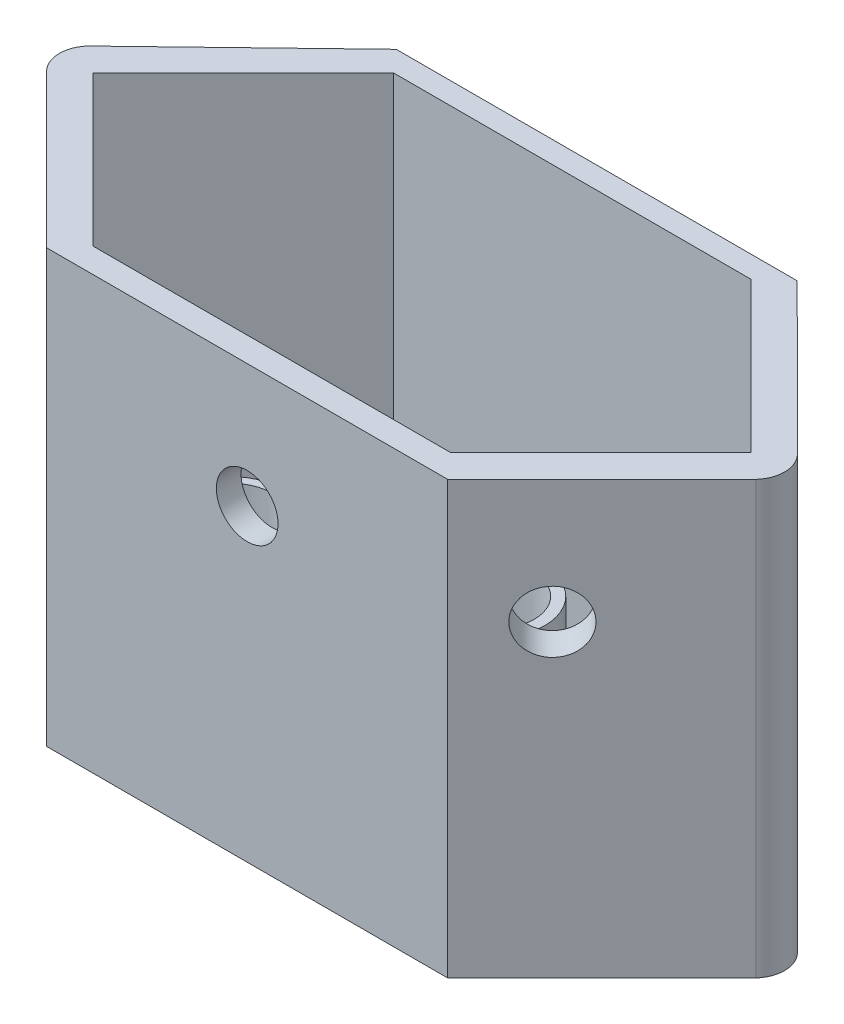
ISO-10303-21;
HEADER;
FILE_DESCRIPTION(('STEP AP214'),'2;1');
FILE_NAME('part.step','',(''),(''),'','','');
FILE_SCHEMA(('AUTOMOTIVE_DESIGN { 1 0 10303 214 1 1 1 1 }'));
ENDSEC;
DATA;
#1=APPLICATION_CONTEXT('core data for automotive mechanical design processes');
#2=APPLICATION_PROTOCOL_DEFINITION('international standard','automotive_design',2000,#1);
#3=PRODUCT_CONTEXT('',#1,'mechanical');
#4=PRODUCT('Part','Part','',(#3));
#5=PRODUCT_RELATED_PRODUCT_CATEGORY('part','',(#4));
#6=PRODUCT_DEFINITION_FORMATION('','',#4);
#7=PRODUCT_DEFINITION_CONTEXT('part definition',#1,'design');
#8=PRODUCT_DEFINITION('design','',#6,#7);
#9=PRODUCT_DEFINITION_SHAPE('','',#8);
#10=(LENGTH_UNIT() NAMED_UNIT(*) SI_UNIT(.MILLI.,.METRE.));
#11=(NAMED_UNIT(*) PLANE_ANGLE_UNIT() SI_UNIT($,.RADIAN.));
#12=(NAMED_UNIT(*) SI_UNIT($,.STERADIAN.) SOLID_ANGLE_UNIT());
#13=UNCERTAINTY_MEASURE_WITH_UNIT(LENGTH_MEASURE(1.E-05),#10,'distance_accuracy_value','');
#14=(GEOMETRIC_REPRESENTATION_CONTEXT(3) GLOBAL_UNCERTAINTY_ASSIGNED_CONTEXT((#13)) GLOBAL_UNIT_ASSIGNED_CONTEXT((#10,
#11,#12)) REPRESENTATION_CONTEXT('',''));
#15=CARTESIAN_POINT('',(0.,0.,0.));
#16=DIRECTION('',(0.,0.,1.));
#17=DIRECTION('',(1.,0.,0.));
#18=AXIS2_PLACEMENT_3D('',#15,#16,#17);
#19=CARTESIAN_POINT('',(0.,1.2,0.));
#20=DIRECTION('',(0.,1.,0.));
#21=DIRECTION('',(0.,0.,1.));
#22=AXIS2_PLACEMENT_3D('',#19,#20,#21);
#23=PLANE('',#22);
#24=CARTESIAN_POINT('',(0.,1.2,-3.5));
#25=DIRECTION('',(0.,1.,0.));
#26=DIRECTION('',(0.,0.,1.));
#27=AXIS2_PLACEMENT_3D('',#24,#25,#26);
#28=CIRCLE('',#27,2.46889669809637);
#29=CARTESIAN_POINT('',(0.,1.2,-1.03110330190363));
#30=VERTEX_POINT('',#29);
#31=EDGE_CURVE('E243',#30,#30,#28,.T.);
#32=ORIENTED_EDGE('',*,*,#31,.F.);
#33=EDGE_LOOP('',(#32));
#34=FACE_BOUND('',#33,.T.);
#35=DIRECTION('',(1.,0.,0.));
#36=VECTOR('',#35,1.);
#37=CARTESIAN_POINT('',(0.,1.2,-7.3));
#38=LINE('',#37,#36);
#39=CARTESIAN_POINT('',(-8.69142135623738,1.2,-7.3));
#40=VERTEX_POINT('',#39);
#41=CARTESIAN_POINT('',(8.6914213562373,1.2,-7.3));
#42=VERTEX_POINT('',#41);
#43=EDGE_CURVE('E191',#40,#42,#38,.T.);
#44=ORIENTED_EDGE('',*,*,#43,.F.);
#45=DIRECTION('',(-0.707106781186547,0.,0.707106781186548));
#46=VECTOR('',#45,1.);
#47=CARTESIAN_POINT('',(-7.9957106781187,1.2,-7.99571067811869));
#48=LINE('',#47,#46);
#49=CARTESIAN_POINT('',(-15.9914213562374,1.2,0.));
#50=VERTEX_POINT('',#49);
#51=EDGE_CURVE('E216',#40,#50,#48,.T.);
#52=ORIENTED_EDGE('',*,*,#51,.T.);
#53=DIRECTION('',(0.707106781186548,0.,0.707106781186547));
#54=VECTOR('',#53,1.);
#55=CARTESIAN_POINT('',(-7.99571067811869,1.2,7.99571067811869));
#56=LINE('',#55,#54);
#57=CARTESIAN_POINT('',(-8.69142135623745,1.2,7.29999999999993));
#58=VERTEX_POINT('',#57);
#59=EDGE_CURVE('E209',#50,#58,#56,.T.);
#60=ORIENTED_EDGE('',*,*,#59,.T.);
#61=DIRECTION('',(1.,0.,0.));
#62=VECTOR('',#61,1.);
#63=CARTESIAN_POINT('',(0.,1.2,7.3));
#64=LINE('',#63,#62);
#65=CARTESIAN_POINT('',(8.69142135623732,1.2,7.3));
#66=VERTEX_POINT('',#65);
#67=EDGE_CURVE('E193',#58,#66,#64,.T.);
#68=ORIENTED_EDGE('',*,*,#67,.T.);
#69=DIRECTION('',(-0.707106781186547,0.,0.707106781186548));
#70=VECTOR('',#69,1.);
#71=CARTESIAN_POINT('',(7.99571067811866,1.2,7.99571067811866));
#72=LINE('',#71,#70);
#73=CARTESIAN_POINT('',(15.9914213562373,1.2,0.));
#74=VERTEX_POINT('',#73);
#75=EDGE_CURVE('E230',#74,#66,#72,.T.);
#76=ORIENTED_EDGE('',*,*,#75,.F.);
#77=DIRECTION('',(0.707106781186548,0.,0.707106781186547));
#78=VECTOR('',#77,1.);
#79=CARTESIAN_POINT('',(7.99571067811865,1.2,-7.99571067811865));
#80=LINE('',#79,#78);
#81=EDGE_CURVE('E224',#42,#74,#80,.T.);
#82=ORIENTED_EDGE('',*,*,#81,.F.);
#83=EDGE_LOOP('',(#44,#52,#60,#68,#76,#82));
#84=FACE_BOUND('',#83,.T.);
#85=CARTESIAN_POINT('',(-9.75,1.2,-0.499999999999995));
#86=DIRECTION('',(0.,1.,0.));
#87=DIRECTION('',(0.,0.,1.));
#88=AXIS2_PLACEMENT_3D('',#85,#86,#87);
#89=CIRCLE('',#88,2.35);
#90=CARTESIAN_POINT('',(-9.75,1.2,1.85));
#91=VERTEX_POINT('',#90);
#92=EDGE_CURVE('E234',#91,#91,#89,.T.);
#93=ORIENTED_EDGE('',*,*,#92,.F.);
#94=EDGE_LOOP('',(#93));
#95=FACE_BOUND('',#94,.T.);
#96=CARTESIAN_POINT('',(9.75,1.2,-0.499999999999997));
#97=DIRECTION('',(0.,1.,0.));
#98=DIRECTION('',(0.,0.,1.));
#99=AXIS2_PLACEMENT_3D('',#96,#97,#98);
#100=CIRCLE('',#99,2.35);
#101=CARTESIAN_POINT('',(9.75,1.2,1.85));
#102=VERTEX_POINT('',#101);
#103=EDGE_CURVE('E252',#102,#102,#100,.T.);
#104=ORIENTED_EDGE('',*,*,#103,.F.);
#105=EDGE_LOOP('',(#104));
#106=FACE_BOUND('',#105,.T.);
#107=ADVANCED_FACE('F34',(#34,#84,#95,#106),#23,.T.);
#108=CARTESIAN_POINT('',(-16.1317993042843,25.,1.73426092409168E-05));
#109=DIRECTION('',(0.,-1.,0.));
#110=DIRECTION('',(0.,0.,-1.));
#111=AXIS2_PLACEMENT_3D('',#108,#109,#110);
#112=CYLINDRICAL_SURFACE('',#111,1.5001676066185);
#113=CARTESIAN_POINT('',(-16.1317993042843,21.,1.73426092409168E-05));
#114=DIRECTION('',(0.,-1.,0.));
#115=DIRECTION('',(0.,0.,-1.));
#116=AXIS2_PLACEMENT_3D('',#113,#114,#115);
#117=CIRCLE('',#116,1.5001676066185);
#118=CARTESIAN_POINT('',(-17.2503076661575,21.,-0.999703564627948));
#119=VERTEX_POINT('',#118);
#120=CARTESIAN_POINT('',(-17.250692691761,21.,0.99930730823902));
#121=VERTEX_POINT('',#120);
#122=EDGE_CURVE('E138',#119,#121,#117,.F.);
#123=ORIENTED_EDGE('',*,*,#122,.F.);
#124=DIRECTION('',(0.,-1.,0.));
#125=VECTOR('',#124,1.);
#126=CARTESIAN_POINT('',(-17.2503076661575,25.,-0.999703564627948));
#127=LINE('',#126,#125);
#128=CARTESIAN_POINT('',(-17.2503076661575,0.,-0.999703564627948));
#129=VERTEX_POINT('',#128);
#130=EDGE_CURVE('E168',#119,#129,#127,.T.);
#131=ORIENTED_EDGE('',*,*,#130,.T.);
#132=CARTESIAN_POINT('',(-16.1317993042843,0.,1.73426092409168E-05));
#133=DIRECTION('',(0.,1.,0.));
#134=DIRECTION('',(0.,0.,1.));
#135=AXIS2_PLACEMENT_3D('',#132,#133,#134);
#136=CIRCLE('',#135,1.5001676066185);
#137=CARTESIAN_POINT('',(-17.250692691761,0.,0.999307308239028));
#138=VERTEX_POINT('',#137);
#139=EDGE_CURVE('E188',#138,#129,#136,.F.);
#140=ORIENTED_EDGE('',*,*,#139,.F.);
#141=DIRECTION('',(0.,-1.,0.));
#142=VECTOR('',#141,1.);
#143=CARTESIAN_POINT('',(-17.250692691761,25.,0.999307308239028));
#144=LINE('',#143,#142);
#145=EDGE_CURVE('E42',#121,#138,#144,.T.);
#146=ORIENTED_EDGE('',*,*,#145,.F.);
#147=EDGE_LOOP('',(#123,#131,#140,#146));
#148=FACE_BOUND('',#147,.T.);
#149=ADVANCED_FACE('F36',(#148),#112,.T.);
#150=CARTESIAN_POINT('',(-9.12499999999994,25.,9.12500000000004));
#151=DIRECTION('',(-0.707106781186543,0.,0.707106781186552));
#152=DIRECTION('',(0.707106781186552,0.,0.707106781186543));
#153=AXIS2_PLACEMENT_3D('',#150,#151,#152);
#154=PLANE('',#153);
#155=CARTESIAN_POINT('',(-12.437005768509,15.,5.81299423149103));
#156=DIRECTION('',(-0.707106781186543,0.,0.707106781186552));
#157=DIRECTION('',(0.707106781186552,0.,0.707106781186543));
#158=AXIS2_PLACEMENT_3D('',#155,#156,#157);
#159=CIRCLE('',#158,1.5);
#160=CARTESIAN_POINT('',(-11.3763455967292,15.,6.87365440327084));
#161=VERTEX_POINT('',#160);
#162=EDGE_CURVE('E292',#161,#161,#159,.T.);
#163=ORIENTED_EDGE('',*,*,#162,.F.);
#164=EDGE_LOOP('',(#163));
#165=FACE_BOUND('',#164,.T.);
#166=DIRECTION('',(0.707106781186552,0.,0.707106781186543));
#167=VECTOR('',#166,1.);
#168=CARTESIAN_POINT('',(-9.12499999999994,21.,9.12500000000004));
#169=LINE('',#168,#167);
#170=CARTESIAN_POINT('',(-9.74999999999999,21.,8.5));
#171=VERTEX_POINT('',#170);
#172=EDGE_CURVE('E132',#121,#171,#169,.T.);
#173=ORIENTED_EDGE('',*,*,#172,.F.);
#174=ORIENTED_EDGE('',*,*,#145,.T.);
#175=DIRECTION('',(-0.707106781186552,0.,-0.707106781186543));
#176=VECTOR('',#175,1.);
#177=CARTESIAN_POINT('',(-9.12499999999994,0.,9.12500000000004));
#178=LINE('',#177,#176);
#179=CARTESIAN_POINT('',(-9.74999999999999,0.,8.50000000000001));
#180=VERTEX_POINT('',#179);
#181=EDGE_CURVE('E156',#180,#138,#178,.T.);
#182=ORIENTED_EDGE('',*,*,#181,.F.);
#183=DIRECTION('',(0.,-1.,0.));
#184=VECTOR('',#183,1.);
#185=CARTESIAN_POINT('',(-9.74999999999999,25.,8.50000000000001));
#186=LINE('',#185,#184);
#187=EDGE_CURVE('E148',#171,#180,#186,.T.);
#188=ORIENTED_EDGE('',*,*,#187,.F.);
#189=EDGE_LOOP('',(#173,#174,#182,#188));
#190=FACE_BOUND('',#189,.T.);
#191=ADVANCED_FACE('F154',(#165,#190),#154,.T.);
#192=CARTESIAN_POINT('',(0.,25.,8.5));
#193=DIRECTION('',(0.,0.,-1.));
#194=DIRECTION('',(-1.,0.,0.));
#195=AXIS2_PLACEMENT_3D('',#192,#193,#194);
#196=PLANE('',#195);
#197=CARTESIAN_POINT('',(0.,15.,8.5));
#198=DIRECTION('',(0.,0.,-1.));
#199=DIRECTION('',(-1.,0.,0.));
#200=AXIS2_PLACEMENT_3D('',#197,#198,#199);
#201=CIRCLE('',#200,1.5);
#202=CARTESIAN_POINT('',(-1.50000000000007,15.,8.5));
#203=VERTEX_POINT('',#202);
#204=EDGE_CURVE('E286',#203,#203,#201,.T.);
#205=ORIENTED_EDGE('',*,*,#204,.T.);
#206=EDGE_LOOP('',(#205));
#207=FACE_BOUND('',#206,.T.);
#208=DIRECTION('',(0.,-1.,0.));
#209=VECTOR('',#208,1.);
#210=CARTESIAN_POINT('',(9.75,25.,8.5));
#211=LINE('',#210,#209);
#212=CARTESIAN_POINT('',(9.75000000000001,21.,8.5));
#213=VERTEX_POINT('',#212);
#214=CARTESIAN_POINT('',(9.75,0.,8.5));
#215=VERTEX_POINT('',#214);
#216=EDGE_CURVE('E150',#213,#215,#211,.T.);
#217=ORIENTED_EDGE('',*,*,#216,.F.);
#218=DIRECTION('',(1.,0.,0.));
#219=VECTOR('',#218,1.);
#220=CARTESIAN_POINT('',(-41.5470865906406,21.,8.5));
#221=LINE('',#220,#219);
#222=EDGE_CURVE('E135',#171,#213,#221,.T.);
#223=ORIENTED_EDGE('',*,*,#222,.F.);
#224=ORIENTED_EDGE('',*,*,#187,.T.);
#225=DIRECTION('',(1.,0.,0.));
#226=VECTOR('',#225,1.);
#227=CARTESIAN_POINT('',(0.,0.,8.5));
#228=LINE('',#227,#226);
#229=EDGE_CURVE('E185',#180,#215,#228,.T.);
#230=ORIENTED_EDGE('',*,*,#229,.T.);
#231=EDGE_LOOP('',(#217,#223,#224,#230));
#232=FACE_BOUND('',#231,.T.);
#233=ADVANCED_FACE('F146',(#207,#232),#196,.F.);
#234=CARTESIAN_POINT('',(9.12500000000002,25.,9.12499999999999));
#235=DIRECTION('',(-0.707106781186549,0.,-0.707106781186546));
#236=DIRECTION('',(-0.707106781186546,0.,0.707106781186549));
#237=AXIS2_PLACEMENT_3D('',#234,#235,#236);
#238=PLANE('',#237);
#239=CARTESIAN_POINT('',(12.2955844122716,15.,5.95441558772842));
#240=DIRECTION('',(-0.707106781186549,0.,-0.707106781186546));
#241=DIRECTION('',(-0.707106781186546,0.,0.707106781186549));
#242=AXIS2_PLACEMENT_3D('',#239,#240,#241);
#243=CIRCLE('',#242,1.5);
#244=CARTESIAN_POINT('',(11.2349242404918,15.,7.01507575950825));
#245=VERTEX_POINT('',#244);
#246=EDGE_CURVE('E151',#245,#245,#243,.T.);
#247=ORIENTED_EDGE('',*,*,#246,.T.);
#248=EDGE_LOOP('',(#247));
#249=FACE_BOUND('',#248,.T.);
#250=DIRECTION('',(0.,-1.,0.));
#251=VECTOR('',#250,1.);
#252=CARTESIAN_POINT('',(17.2499999999999,25.,1.00000000000006));
#253=LINE('',#252,#251);
#254=CARTESIAN_POINT('',(17.2499999999999,21.,1.00000000000005));
#255=VERTEX_POINT('',#254);
#256=CARTESIAN_POINT('',(17.2499999999999,0.,1.00000000000006));
#257=VERTEX_POINT('',#256);
#258=EDGE_CURVE('E158',#255,#257,#253,.T.);
#259=ORIENTED_EDGE('',*,*,#258,.F.);
#260=DIRECTION('',(-0.707106781186546,0.,0.707106781186549));
#261=VECTOR('',#260,1.);
#262=CARTESIAN_POINT('',(9.12500000000002,21.,9.12499999999999));
#263=LINE('',#262,#261);
#264=EDGE_CURVE('E260',#255,#213,#263,.T.);
#265=ORIENTED_EDGE('',*,*,#264,.T.);
#266=ORIENTED_EDGE('',*,*,#216,.T.);
#267=DIRECTION('',(0.707106781186546,0.,-0.707106781186549));
#268=VECTOR('',#267,1.);
#269=CARTESIAN_POINT('',(9.12500000000002,0.,9.12499999999999));
#270=LINE('',#269,#268);
#271=EDGE_CURVE('E182',#215,#257,#270,.T.);
#272=ORIENTED_EDGE('',*,*,#271,.T.);
#273=EDGE_LOOP('',(#259,#265,#266,#272));
#274=FACE_BOUND('',#273,.T.);
#275=ADVANCED_FACE('F409',(#249,#274),#238,.F.);
#276=CARTESIAN_POINT('',(16.1319660112501,25.,0.));
#277=DIRECTION('',(0.,-1.,0.));
#278=DIRECTION('',(0.,0.,-1.));
#279=AXIS2_PLACEMENT_3D('',#276,#277,#278);
#280=CYLINDRICAL_SURFACE('',#279,1.5);
#281=CARTESIAN_POINT('',(16.1319660112501,21.,0.));
#282=DIRECTION('',(0.,-1.,0.));
#283=DIRECTION('',(0.,0.,-1.));
#284=AXIS2_PLACEMENT_3D('',#281,#282,#283);
#285=CIRCLE('',#284,1.5);
#286=CARTESIAN_POINT('',(17.25,21.,-1.00000000000001));
#287=VERTEX_POINT('',#286);
#288=EDGE_CURVE('E262',#255,#287,#285,.F.);
#289=ORIENTED_EDGE('',*,*,#288,.F.);
#290=ORIENTED_EDGE('',*,*,#258,.T.);
#291=CARTESIAN_POINT('',(16.1319660112501,0.,0.));
#292=DIRECTION('',(0.,1.,0.));
#293=DIRECTION('',(0.,0.,1.));
#294=AXIS2_PLACEMENT_3D('',#291,#292,#293);
#295=CIRCLE('',#294,1.5);
#296=CARTESIAN_POINT('',(17.25,0.,-1.00000000000002));
#297=VERTEX_POINT('',#296);
#298=EDGE_CURVE('E179',#297,#257,#295,.F.);
#299=ORIENTED_EDGE('',*,*,#298,.F.);
#300=DIRECTION('',(0.,-1.,0.));
#301=VECTOR('',#300,1.);
#302=CARTESIAN_POINT('',(17.25,25.,-1.00000000000002));
#303=LINE('',#302,#301);
#304=EDGE_CURVE('E162',#287,#297,#303,.T.);
#305=ORIENTED_EDGE('',*,*,#304,.F.);
#306=EDGE_LOOP('',(#289,#290,#299,#305));
#307=FACE_BOUND('',#306,.T.);
#308=ADVANCED_FACE('F415',(#307),#280,.T.);
#309=CARTESIAN_POINT('',(9.12196362464636,25.,-9.12517548550626));
#310=DIRECTION('',(0.70698230532064,0.,-0.707231235144145));
#311=DIRECTION('',(-0.707231235144145,0.,-0.70698230532064));
#312=AXIS2_PLACEMENT_3D('',#309,#310,#311);
#313=PLANE('',#312);
#314=DIRECTION('',(-0.707231235144145,0.,-0.70698230532064));
#315=VECTOR('',#314,1.);
#316=CARTESIAN_POINT('',(9.12196362464636,21.,-9.12517548550626));
#317=LINE('',#316,#315);
#318=CARTESIAN_POINT('',(9.88811198114129,21.,-8.35929679636435));
#319=VERTEX_POINT('',#318);
#320=EDGE_CURVE('E264',#287,#319,#317,.T.);
#321=ORIENTED_EDGE('',*,*,#320,.F.);
#322=ORIENTED_EDGE('',*,*,#304,.T.);
#323=DIRECTION('',(0.707231235144145,0.,0.70698230532064));
#324=VECTOR('',#323,1.);
#325=CARTESIAN_POINT('',(9.12196362464636,0.,-9.12517548550626));
#326=LINE('',#325,#324);
#327=CARTESIAN_POINT('',(9.88811198114129,0.,-8.35929679636435));
#328=VERTEX_POINT('',#327);
#329=EDGE_CURVE('E176',#328,#297,#326,.T.);
#330=ORIENTED_EDGE('',*,*,#329,.F.);
#331=DIRECTION('',(0.,-1.,0.));
#332=VECTOR('',#331,1.);
#333=CARTESIAN_POINT('',(9.88811198114129,25.,-8.35929679636435));
#334=LINE('',#333,#332);
#335=EDGE_CURVE('E164',#319,#328,#334,.T.);
#336=ORIENTED_EDGE('',*,*,#335,.F.);
#337=EDGE_LOOP('',(#321,#322,#330,#336));
#338=FACE_BOUND('',#337,.T.);
#339=ADVANCED_FACE('F419',(#338),#313,.T.);
#340=CARTESIAN_POINT('',(0.,25.,-8.35929679636435));
#341=DIRECTION('',(0.,0.,-1.));
#342=DIRECTION('',(-1.,0.,0.));
#343=AXIS2_PLACEMENT_3D('',#340,#341,#342);
#344=PLANE('',#343);
#345=DIRECTION('',(-1.,0.,0.));
#346=VECTOR('',#345,1.);
#347=CARTESIAN_POINT('',(0.,21.,-8.35929679636435));
#348=LINE('',#347,#346);
#349=CARTESIAN_POINT('',(-9.61188801885871,21.,-8.35929679636435));
#350=VERTEX_POINT('',#349);
#351=EDGE_CURVE('E49',#319,#350,#348,.T.);
#352=ORIENTED_EDGE('',*,*,#351,.F.);
#353=ORIENTED_EDGE('',*,*,#335,.T.);
#354=DIRECTION('',(1.,0.,0.));
#355=VECTOR('',#354,1.);
#356=CARTESIAN_POINT('',(0.,0.,-8.35929679636435));
#357=LINE('',#356,#355);
#358=CARTESIAN_POINT('',(-9.61188801885871,0.,-8.35929679636435));
#359=VERTEX_POINT('',#358);
#360=EDGE_CURVE('E173',#359,#328,#357,.T.);
#361=ORIENTED_EDGE('',*,*,#360,.F.);
#362=DIRECTION('',(0.,-1.,0.));
#363=VECTOR('',#362,1.);
#364=CARTESIAN_POINT('',(-9.61188801885871,25.,-8.35929679636435));
#365=LINE('',#364,#363);
#366=EDGE_CURVE('E166',#350,#359,#365,.T.);
#367=ORIENTED_EDGE('',*,*,#366,.F.);
#368=EDGE_LOOP('',(#352,#353,#361,#367));
#369=FACE_BOUND('',#368,.T.);
#370=ADVANCED_FACE('F423',(#369),#344,.T.);
#371=CARTESIAN_POINT('',(-8.80407243656507,25.,-9.13762456132839));
#372=DIRECTION('',(-0.693841143676791,0.,-0.720128090926387));
#373=DIRECTION('',(-0.720128090926387,0.,0.693841143676791));
#374=AXIS2_PLACEMENT_3D('',#371,#372,#373);
#375=PLANE('',#374);
#376=DIRECTION('',(-0.720128090926387,0.,0.693841143676791));
#377=VECTOR('',#376,1.);
#378=CARTESIAN_POINT('',(-8.80407243656507,21.,-9.13762456132839));
#379=LINE('',#378,#377);
#380=EDGE_CURVE('E267',#350,#119,#379,.T.);
#381=ORIENTED_EDGE('',*,*,#380,.F.);
#382=ORIENTED_EDGE('',*,*,#366,.T.);
#383=DIRECTION('',(0.720128090926387,0.,-0.693841143676791));
#384=VECTOR('',#383,1.);
#385=CARTESIAN_POINT('',(-8.80407243656507,0.,-9.13762456132839));
#386=LINE('',#385,#384);
#387=EDGE_CURVE('E170',#129,#359,#386,.T.);
#388=ORIENTED_EDGE('',*,*,#387,.F.);
#389=ORIENTED_EDGE('',*,*,#130,.F.);
#390=EDGE_LOOP('',(#381,#382,#388,#389));
#391=FACE_BOUND('',#390,.T.);
#392=ADVANCED_FACE('F427',(#391),#375,.T.);
#393=CARTESIAN_POINT('',(0.,0.,0.));
#394=DIRECTION('',(0.,1.,0.));
#395=DIRECTION('',(0.,0.,1.));
#396=AXIS2_PLACEMENT_3D('',#393,#394,#395);
#397=PLANE('',#396);
#398=CARTESIAN_POINT('',(-9.75,0.,-0.499999999999995));
#399=DIRECTION('',(0.,1.,0.));
#400=DIRECTION('',(0.,0.,1.));
#401=AXIS2_PLACEMENT_3D('',#398,#399,#400);
#402=CIRCLE('',#401,1.95);
#403=CARTESIAN_POINT('',(-9.75,0.,1.45000000000001));
#404=VERTEX_POINT('',#403);
#405=EDGE_CURVE('E198',#404,#404,#402,.T.);
#406=ORIENTED_EDGE('',*,*,#405,.T.);
#407=EDGE_LOOP('',(#406));
#408=FACE_BOUND('',#407,.T.);
#409=CARTESIAN_POINT('',(9.75,0.,-0.499999999999997));
#410=DIRECTION('',(0.,1.,0.));
#411=DIRECTION('',(0.,0.,1.));
#412=AXIS2_PLACEMENT_3D('',#409,#410,#411);
#413=CIRCLE('',#412,1.95);
#414=CARTESIAN_POINT('',(9.75,0.,1.45));
#415=VERTEX_POINT('',#414);
#416=EDGE_CURVE('E201',#415,#415,#413,.T.);
#417=ORIENTED_EDGE('',*,*,#416,.T.);
#418=EDGE_LOOP('',(#417));
#419=FACE_BOUND('',#418,.T.);
#420=CARTESIAN_POINT('',(0.,0.,-3.5));
#421=DIRECTION('',(0.,1.,0.));
#422=DIRECTION('',(0.,0.,1.));
#423=AXIS2_PLACEMENT_3D('',#420,#421,#422);
#424=CIRCLE('',#423,1.95);
#425=CARTESIAN_POINT('',(0.,0.,-1.55));
#426=VERTEX_POINT('',#425);
#427=EDGE_CURVE('E195',#426,#426,#424,.T.);
#428=ORIENTED_EDGE('',*,*,#427,.T.);
#429=EDGE_LOOP('',(#428));
#430=FACE_BOUND('',#429,.T.);
#431=ORIENTED_EDGE('',*,*,#139,.T.);
#432=ORIENTED_EDGE('',*,*,#387,.T.);
#433=ORIENTED_EDGE('',*,*,#360,.T.);
#434=ORIENTED_EDGE('',*,*,#329,.T.);
#435=ORIENTED_EDGE('',*,*,#298,.T.);
#436=ORIENTED_EDGE('',*,*,#271,.F.);
#437=ORIENTED_EDGE('',*,*,#229,.F.);
#438=ORIENTED_EDGE('',*,*,#181,.T.);
#439=EDGE_LOOP('',(#431,#432,#433,#434,#435,#436,#437,#438));
#440=FACE_BOUND('',#439,.T.);
#441=ADVANCED_FACE('F338',(#408,#419,#430,#440),#397,.F.);
#442=CARTESIAN_POINT('',(0.,1.2,-7.3));
#443=DIRECTION('',(0.,0.,1.));
#444=DIRECTION('',(1.,0.,0.));
#445=AXIS2_PLACEMENT_3D('',#442,#443,#444);
#446=PLANE('',#445);
#447=DIRECTION('',(1.,0.,0.));
#448=VECTOR('',#447,1.);
#449=CARTESIAN_POINT('',(0.,21.,-7.3));
#450=LINE('',#449,#448);
#451=CARTESIAN_POINT('',(-8.69142135623738,21.,-7.3));
#452=VERTEX_POINT('',#451);
#453=CARTESIAN_POINT('',(8.6914213562373,21.,-7.3));
#454=VERTEX_POINT('',#453);
#455=EDGE_CURVE('E275',#452,#454,#450,.T.);
#456=ORIENTED_EDGE('',*,*,#455,.F.);
#457=DIRECTION('',(0.,1.,0.));
#458=VECTOR('',#457,1.);
#459=CARTESIAN_POINT('',(-8.69142135623738,1.2,-7.3));
#460=LINE('',#459,#458);
#461=EDGE_CURVE('E204',#40,#452,#460,.T.);
#462=ORIENTED_EDGE('',*,*,#461,.F.);
#463=ORIENTED_EDGE('',*,*,#43,.T.);
#464=DIRECTION('',(0.,1.,0.));
#465=VECTOR('',#464,1.);
#466=CARTESIAN_POINT('',(8.6914213562373,1.2,-7.3));
#467=LINE('',#466,#465);
#468=EDGE_CURVE('E219',#42,#454,#467,.T.);
#469=ORIENTED_EDGE('',*,*,#468,.T.);
#470=EDGE_LOOP('',(#456,#462,#463,#469));
#471=FACE_BOUND('',#470,.T.);
#472=ADVANCED_FACE('F314',(#471),#446,.T.);
#473=CARTESIAN_POINT('',(0.,1.2,7.3));
#474=DIRECTION('',(0.,0.,1.));
#475=DIRECTION('',(1.,0.,0.));
#476=AXIS2_PLACEMENT_3D('',#473,#474,#475);
#477=PLANE('',#476);
#478=CARTESIAN_POINT('',(0.,15.,7.3));
#479=DIRECTION('',(0.,0.,-1.));
#480=DIRECTION('',(-1.,0.,0.));
#481=AXIS2_PLACEMENT_3D('',#478,#479,#480);
#482=CIRCLE('',#481,1.5);
#483=CARTESIAN_POINT('',(-1.50000000000007,15.,7.3));
#484=VERTEX_POINT('',#483);
#485=EDGE_CURVE('E289',#484,#484,#482,.T.);
#486=ORIENTED_EDGE('',*,*,#485,.F.);
#487=EDGE_LOOP('',(#486));
#488=FACE_BOUND('',#487,.T.);
#489=DIRECTION('',(0.,1.,0.));
#490=VECTOR('',#489,1.);
#491=CARTESIAN_POINT('',(-8.69142135623745,1.2,7.29999999999993));
#492=LINE('',#491,#490);
#493=CARTESIAN_POINT('',(-8.69142135623745,21.,7.3));
#494=VERTEX_POINT('',#493);
#495=EDGE_CURVE('E208',#58,#494,#492,.T.);
#496=ORIENTED_EDGE('',*,*,#495,.T.);
#497=DIRECTION('',(1.,0.,0.));
#498=VECTOR('',#497,1.);
#499=CARTESIAN_POINT('',(0.,21.,7.3));
#500=LINE('',#499,#498);
#501=CARTESIAN_POINT('',(8.69142135623732,21.,7.3));
#502=VERTEX_POINT('',#501);
#503=EDGE_CURVE('E277',#494,#502,#500,.T.);
#504=ORIENTED_EDGE('',*,*,#503,.T.);
#505=DIRECTION('',(0.,1.,0.));
#506=VECTOR('',#505,1.);
#507=CARTESIAN_POINT('',(8.69142135623732,1.2,7.3));
#508=LINE('',#507,#506);
#509=EDGE_CURVE('E220',#66,#502,#508,.T.);
#510=ORIENTED_EDGE('',*,*,#509,.F.);
#511=ORIENTED_EDGE('',*,*,#67,.F.);
#512=EDGE_LOOP('',(#496,#504,#510,#511));
#513=FACE_BOUND('',#512,.T.);
#514=ADVANCED_FACE('F326',(#488,#513),#477,.F.);
#515=CARTESIAN_POINT('',(0.,-22.6,-3.5));
#516=DIRECTION('',(0.,1.,0.));
#517=DIRECTION('',(0.,0.,1.));
#518=AXIS2_PLACEMENT_3D('',#515,#516,#517);
#519=CYLINDRICAL_SURFACE('',#518,1.95);
#520=ORIENTED_EDGE('',*,*,#427,.F.);
#521=EDGE_LOOP('',(#520));
#522=FACE_BOUND('',#521,.T.);
#523=CARTESIAN_POINT('',(0.,5.2,-3.5));
#524=DIRECTION('',(0.,1.,0.));
#525=DIRECTION('',(0.,0.,1.));
#526=AXIS2_PLACEMENT_3D('',#523,#524,#525);
#527=CIRCLE('',#526,1.95);
#528=CARTESIAN_POINT('',(0.,5.2,-1.54999999999999));
#529=VERTEX_POINT('',#528);
#530=EDGE_CURVE('E246',#529,#529,#527,.T.);
#531=ORIENTED_EDGE('',*,*,#530,.T.);
#532=EDGE_LOOP('',(#531));
#533=FACE_BOUND('',#532,.T.);
#534=ADVANCED_FACE('F328',(#522,#533),#519,.F.);
#535=CARTESIAN_POINT('',(9.75,-22.6,-0.499999999999997));
#536=DIRECTION('',(0.,1.,0.));
#537=DIRECTION('',(0.,0.,1.));
#538=AXIS2_PLACEMENT_3D('',#535,#536,#537);
#539=CYLINDRICAL_SURFACE('',#538,1.95);
#540=ORIENTED_EDGE('',*,*,#416,.F.);
#541=EDGE_LOOP('',(#540));
#542=FACE_BOUND('',#541,.T.);
#543=CARTESIAN_POINT('',(9.75,5.2,-0.499999999999997));
#544=DIRECTION('',(0.,1.,0.));
#545=DIRECTION('',(0.,0.,1.));
#546=AXIS2_PLACEMENT_3D('',#543,#544,#545);
#547=CIRCLE('',#546,1.95);
#548=CARTESIAN_POINT('',(9.75,5.2,1.45));
#549=VERTEX_POINT('',#548);
#550=EDGE_CURVE('E142',#549,#549,#547,.T.);
#551=ORIENTED_EDGE('',*,*,#550,.T.);
#552=EDGE_LOOP('',(#551));
#553=FACE_BOUND('',#552,.T.);
#554=ADVANCED_FACE('F335',(#542,#553),#539,.F.);
#555=CARTESIAN_POINT('',(-9.75,-22.6,-0.499999999999995));
#556=DIRECTION('',(0.,1.,0.));
#557=DIRECTION('',(0.,0.,1.));
#558=AXIS2_PLACEMENT_3D('',#555,#556,#557);
#559=CYLINDRICAL_SURFACE('',#558,1.95);
#560=ORIENTED_EDGE('',*,*,#405,.F.);
#561=EDGE_LOOP('',(#560));
#562=FACE_BOUND('',#561,.T.);
#563=CARTESIAN_POINT('',(-9.75,5.2,-0.499999999999995));
#564=DIRECTION('',(0.,1.,0.));
#565=DIRECTION('',(0.,0.,1.));
#566=AXIS2_PLACEMENT_3D('',#563,#564,#565);
#567=CIRCLE('',#566,1.95);
#568=CARTESIAN_POINT('',(-9.75,5.2,1.45000000000001));
#569=VERTEX_POINT('',#568);
#570=EDGE_CURVE('E237',#569,#569,#567,.T.);
#571=ORIENTED_EDGE('',*,*,#570,.T.);
#572=EDGE_LOOP('',(#571));
#573=FACE_BOUND('',#572,.T.);
#574=ADVANCED_FACE('F353',(#562,#573),#559,.F.);
#575=CARTESIAN_POINT('',(-7.9957106781187,1.2,-7.99571067811869));
#576=DIRECTION('',(-0.707106781186548,0.,-0.707106781186547));
#577=DIRECTION('',(-0.707106781186547,0.,0.707106781186548));
#578=AXIS2_PLACEMENT_3D('',#575,#576,#577);
#579=PLANE('',#578);
#580=ORIENTED_EDGE('',*,*,#461,.T.);
#581=DIRECTION('',(-0.707106781186547,0.,0.707106781186548));
#582=VECTOR('',#581,1.);
#583=CARTESIAN_POINT('',(-7.9957106781187,21.,-7.99571067811869));
#584=LINE('',#583,#582);
#585=CARTESIAN_POINT('',(-15.9914213562374,21.,0.));
#586=VERTEX_POINT('',#585);
#587=EDGE_CURVE('E269',#452,#586,#584,.T.);
#588=ORIENTED_EDGE('',*,*,#587,.T.);
#589=DIRECTION('',(0.,1.,0.));
#590=VECTOR('',#589,1.);
#591=CARTESIAN_POINT('',(-15.9914213562374,1.2,0.));
#592=LINE('',#591,#590);
#593=EDGE_CURVE('E205',#50,#586,#592,.T.);
#594=ORIENTED_EDGE('',*,*,#593,.F.);
#595=ORIENTED_EDGE('',*,*,#51,.F.);
#596=EDGE_LOOP('',(#580,#588,#594,#595));
#597=FACE_BOUND('',#596,.T.);
#598=ADVANCED_FACE('F305',(#597),#579,.F.);
#599=CARTESIAN_POINT('',(-7.99571067811869,1.2,7.99571067811869));
#600=DIRECTION('',(-0.707106781186547,0.,0.707106781186548));
#601=DIRECTION('',(0.707106781186548,0.,0.707106781186547));
#602=AXIS2_PLACEMENT_3D('',#599,#600,#601);
#603=PLANE('',#602);
#604=CARTESIAN_POINT('',(-11.3077164466277,15.,4.6837049096097));
#605=DIRECTION('',(0.707106781186547,0.,-0.707106781186548));
#606=DIRECTION('',(-0.707106781186548,0.,-0.707106781186547));
#607=AXIS2_PLACEMENT_3D('',#604,#605,#606);
#608=CIRCLE('',#607,1.5);
#609=CARTESIAN_POINT('',(-12.3683766184075,15.,3.62304473782988));
#610=VERTEX_POINT('',#609);
#611=EDGE_CURVE('E295',#610,#610,#608,.T.);
#612=ORIENTED_EDGE('',*,*,#611,.F.);
#613=EDGE_LOOP('',(#612));
#614=FACE_BOUND('',#613,.T.);
#615=ORIENTED_EDGE('',*,*,#593,.T.);
#616=DIRECTION('',(0.707106781186548,0.,0.707106781186547));
#617=VECTOR('',#616,1.);
#618=CARTESIAN_POINT('',(-7.99571067811869,21.,7.99571067811869));
#619=LINE('',#618,#617);
#620=EDGE_CURVE('E272',#586,#494,#619,.T.);
#621=ORIENTED_EDGE('',*,*,#620,.T.);
#622=ORIENTED_EDGE('',*,*,#495,.F.);
#623=ORIENTED_EDGE('',*,*,#59,.F.);
#624=EDGE_LOOP('',(#615,#621,#622,#623));
#625=FACE_BOUND('',#624,.T.);
#626=ADVANCED_FACE('F301',(#614,#625),#603,.F.);
#627=CARTESIAN_POINT('',(7.99571067811865,1.2,-7.99571067811865));
#628=DIRECTION('',(-0.707106781186547,0.,0.707106781186548));
#629=DIRECTION('',(0.707106781186548,0.,0.707106781186547));
#630=AXIS2_PLACEMENT_3D('',#627,#628,#629);
#631=PLANE('',#630);
#632=DIRECTION('',(0.707106781186548,0.,0.707106781186547));
#633=VECTOR('',#632,1.);
#634=CARTESIAN_POINT('',(7.99571067811865,21.,-7.99571067811865));
#635=LINE('',#634,#633);
#636=CARTESIAN_POINT('',(15.9914213562373,21.,0.));
#637=VERTEX_POINT('',#636);
#638=EDGE_CURVE('E56',#454,#637,#635,.T.);
#639=ORIENTED_EDGE('',*,*,#638,.F.);
#640=ORIENTED_EDGE('',*,*,#468,.F.);
#641=ORIENTED_EDGE('',*,*,#81,.T.);
#642=DIRECTION('',(0.,1.,0.));
#643=VECTOR('',#642,1.);
#644=CARTESIAN_POINT('',(15.9914213562373,1.2,0.));
#645=LINE('',#644,#643);
#646=EDGE_CURVE('E223',#74,#637,#645,.T.);
#647=ORIENTED_EDGE('',*,*,#646,.T.);
#648=EDGE_LOOP('',(#639,#640,#641,#647));
#649=FACE_BOUND('',#648,.T.);
#650=ADVANCED_FACE('F304',(#649),#631,.T.);
#651=CARTESIAN_POINT('',(7.99571067811866,1.2,7.99571067811866));
#652=DIRECTION('',(-0.707106781186548,0.,-0.707106781186547));
#653=DIRECTION('',(-0.707106781186547,0.,0.707106781186548));
#654=AXIS2_PLACEMENT_3D('',#651,#652,#653);
#655=PLANE('',#654);
#656=CARTESIAN_POINT('',(11.1662950903902,15.,4.82512626584709));
#657=DIRECTION('',(-0.707106781186548,0.,-0.707106781186548));
#658=DIRECTION('',(-0.707106781186548,0.,0.707106781186548));
#659=AXIS2_PLACEMENT_3D('',#656,#657,#658);
#660=CIRCLE('',#659,1.5);
#661=CARTESIAN_POINT('',(10.1056349186104,15.,5.88578643762691));
#662=VERTEX_POINT('',#661);
#663=EDGE_CURVE('E283',#662,#662,#660,.T.);
#664=ORIENTED_EDGE('',*,*,#663,.F.);
#665=EDGE_LOOP('',(#664));
#666=FACE_BOUND('',#665,.T.);
#667=DIRECTION('',(-0.707106781186547,0.,0.707106781186548));
#668=VECTOR('',#667,1.);
#669=CARTESIAN_POINT('',(7.99571067811866,21.,7.99571067811866));
#670=LINE('',#669,#668);
#671=EDGE_CURVE('E11',#637,#502,#670,.T.);
#672=ORIENTED_EDGE('',*,*,#671,.F.);
#673=ORIENTED_EDGE('',*,*,#646,.F.);
#674=ORIENTED_EDGE('',*,*,#75,.T.);
#675=ORIENTED_EDGE('',*,*,#509,.T.);
#676=EDGE_LOOP('',(#672,#673,#674,#675));
#677=FACE_BOUND('',#676,.T.);
#678=ADVANCED_FACE('F324',(#666,#677),#655,.T.);
#679=CARTESIAN_POINT('',(-9.75,5.2,-0.499999999999995));
#680=DIRECTION('',(0.,1.,0.));
#681=DIRECTION('',(0.,0.,1.));
#682=AXIS2_PLACEMENT_3D('',#679,#680,#681);
#683=PLANE('',#682);
#684=CARTESIAN_POINT('',(-9.75,5.2,-0.499999999999995));
#685=DIRECTION('',(0.,1.,0.));
#686=DIRECTION('',(0.,0.,1.));
#687=AXIS2_PLACEMENT_3D('',#684,#685,#686);
#688=CIRCLE('',#687,2.35);
#689=CARTESIAN_POINT('',(-9.75,5.2,1.85));
#690=VERTEX_POINT('',#689);
#691=EDGE_CURVE('E233',#690,#690,#688,.T.);
#692=ORIENTED_EDGE('',*,*,#691,.T.);
#693=EDGE_LOOP('',(#692));
#694=FACE_BOUND('',#693,.T.);
#695=ORIENTED_EDGE('',*,*,#570,.F.);
#696=EDGE_LOOP('',(#695));
#697=FACE_BOUND('',#696,.T.);
#698=ADVANCED_FACE('F362',(#694,#697),#683,.T.);
#699=CARTESIAN_POINT('',(-9.75,5.2,-0.499999999999995));
#700=DIRECTION('',(0.,-1.,0.));
#701=DIRECTION('',(0.,0.,-1.));
#702=AXIS2_PLACEMENT_3D('',#699,#700,#701);
#703=CYLINDRICAL_SURFACE('',#702,2.35);
#704=ORIENTED_EDGE('',*,*,#691,.F.);
#705=EDGE_LOOP('',(#704));
#706=FACE_BOUND('',#705,.T.);
#707=ORIENTED_EDGE('',*,*,#92,.T.);
#708=EDGE_LOOP('',(#707));
#709=FACE_BOUND('',#708,.T.);
#710=ADVANCED_FACE('F366',(#706,#709),#703,.T.);
#711=CARTESIAN_POINT('',(0.,5.2,-3.5));
#712=DIRECTION('',(0.,1.,0.));
#713=DIRECTION('',(0.,0.,1.));
#714=AXIS2_PLACEMENT_3D('',#711,#712,#713);
#715=PLANE('',#714);
#716=CARTESIAN_POINT('',(0.,5.2,-3.5));
#717=DIRECTION('',(0.,1.,0.));
#718=DIRECTION('',(0.,0.,1.));
#719=AXIS2_PLACEMENT_3D('',#716,#717,#718);
#720=CIRCLE('',#719,2.46889669809637);
#721=CARTESIAN_POINT('',(0.,5.2,-1.03110330190363));
#722=VERTEX_POINT('',#721);
#723=EDGE_CURVE('E242',#722,#722,#720,.T.);
#724=ORIENTED_EDGE('',*,*,#723,.T.);
#725=EDGE_LOOP('',(#724));
#726=FACE_BOUND('',#725,.T.);
#727=ORIENTED_EDGE('',*,*,#530,.F.);
#728=EDGE_LOOP('',(#727));
#729=FACE_BOUND('',#728,.T.);
#730=ADVANCED_FACE('F369',(#726,#729),#715,.T.);
#731=CARTESIAN_POINT('',(0.,5.2,-3.5));
#732=DIRECTION('',(0.,-1.,0.));
#733=DIRECTION('',(0.,0.,-1.));
#734=AXIS2_PLACEMENT_3D('',#731,#732,#733);
#735=CYLINDRICAL_SURFACE('',#734,2.46889669809637);
#736=ORIENTED_EDGE('',*,*,#723,.F.);
#737=EDGE_LOOP('',(#736));
#738=FACE_BOUND('',#737,.T.);
#739=ORIENTED_EDGE('',*,*,#31,.T.);
#740=EDGE_LOOP('',(#739));
#741=FACE_BOUND('',#740,.T.);
#742=ADVANCED_FACE('F374',(#738,#741),#735,.T.);
#743=CARTESIAN_POINT('',(9.75,5.2,-0.499999999999997));
#744=DIRECTION('',(0.,1.,0.));
#745=DIRECTION('',(0.,0.,1.));
#746=AXIS2_PLACEMENT_3D('',#743,#744,#745);
#747=PLANE('',#746);
#748=CARTESIAN_POINT('',(9.75,5.2,-0.499999999999997));
#749=DIRECTION('',(0.,1.,0.));
#750=DIRECTION('',(0.,0.,1.));
#751=AXIS2_PLACEMENT_3D('',#748,#749,#750);
#752=CIRCLE('',#751,2.35);
#753=CARTESIAN_POINT('',(9.75,5.2,1.85));
#754=VERTEX_POINT('',#753);
#755=EDGE_CURVE('E251',#754,#754,#752,.T.);
#756=ORIENTED_EDGE('',*,*,#755,.T.);
#757=EDGE_LOOP('',(#756));
#758=FACE_BOUND('',#757,.T.);
#759=ORIENTED_EDGE('',*,*,#550,.F.);
#760=EDGE_LOOP('',(#759));
#761=FACE_BOUND('',#760,.T.);
#762=ADVANCED_FACE('F377',(#758,#761),#747,.T.);
#763=CARTESIAN_POINT('',(9.75,5.2,-0.499999999999997));
#764=DIRECTION('',(0.,-1.,0.));
#765=DIRECTION('',(0.,0.,-1.));
#766=AXIS2_PLACEMENT_3D('',#763,#764,#765);
#767=CYLINDRICAL_SURFACE('',#766,2.35);
#768=ORIENTED_EDGE('',*,*,#755,.F.);
#769=EDGE_LOOP('',(#768));
#770=FACE_BOUND('',#769,.T.);
#771=ORIENTED_EDGE('',*,*,#103,.T.);
#772=EDGE_LOOP('',(#771));
#773=FACE_BOUND('',#772,.T.);
#774=ADVANCED_FACE('F382',(#770,#773),#767,.T.);
#775=CARTESIAN_POINT('',(-41.5470865906406,21.,-21.5));
#776=DIRECTION('',(0.,-1.,0.));
#777=DIRECTION('',(0.,0.,-1.));
#778=AXIS2_PLACEMENT_3D('',#775,#776,#777);
#779=PLANE('',#778);
#780=ORIENTED_EDGE('',*,*,#172,.T.);
#781=ORIENTED_EDGE('',*,*,#222,.T.);
#782=ORIENTED_EDGE('',*,*,#264,.F.);
#783=ORIENTED_EDGE('',*,*,#288,.T.);
#784=ORIENTED_EDGE('',*,*,#320,.T.);
#785=ORIENTED_EDGE('',*,*,#351,.T.);
#786=ORIENTED_EDGE('',*,*,#380,.T.);
#787=ORIENTED_EDGE('',*,*,#122,.T.);
#788=EDGE_LOOP('',(#780,#781,#782,#783,#784,#785,#786,#787));
#789=FACE_BOUND('',#788,.T.);
#790=ORIENTED_EDGE('',*,*,#455,.T.);
#791=ORIENTED_EDGE('',*,*,#638,.T.);
#792=ORIENTED_EDGE('',*,*,#671,.T.);
#793=ORIENTED_EDGE('',*,*,#503,.F.);
#794=ORIENTED_EDGE('',*,*,#620,.F.);
#795=ORIENTED_EDGE('',*,*,#587,.F.);
#796=EDGE_LOOP('',(#790,#791,#792,#793,#794,#795));
#797=FACE_BOUND('',#796,.T.);
#798=ADVANCED_FACE('F134',(#789,#797),#779,.F.);
#799=CARTESIAN_POINT('',(32.3794985259867,15.,26.0383297014435));
#800=DIRECTION('',(-0.707106781186547,0.,-0.707106781186547));
#801=DIRECTION('',(-0.707106781186548,0.,0.707106781186548));
#802=AXIS2_PLACEMENT_3D('',#799,#800,#801);
#803=CYLINDRICAL_SURFACE('',#802,1.5);
#804=ORIENTED_EDGE('',*,*,#663,.T.);
#805=EDGE_LOOP('',(#804));
#806=FACE_BOUND('',#805,.T.);
#807=ORIENTED_EDGE('',*,*,#246,.F.);
#808=EDGE_LOOP('',(#807));
#809=FACE_BOUND('',#808,.T.);
#810=ADVANCED_FACE('F391',(#806,#809),#803,.F.);
#811=CARTESIAN_POINT('',(0.,15.,37.3));
#812=DIRECTION('',(0.,0.,-1.));
#813=DIRECTION('',(-1.,0.,0.));
#814=AXIS2_PLACEMENT_3D('',#811,#812,#813);
#815=CYLINDRICAL_SURFACE('',#814,1.5);
#816=ORIENTED_EDGE('',*,*,#485,.T.);
#817=EDGE_LOOP('',(#816));
#818=FACE_BOUND('',#817,.T.);
#819=ORIENTED_EDGE('',*,*,#204,.F.);
#820=EDGE_LOOP('',(#819));
#821=FACE_BOUND('',#820,.T.);
#822=ADVANCED_FACE('F394',(#818,#821),#815,.F.);
#823=CARTESIAN_POINT('',(-32.5209198822241,15.,25.8969083452061));
#824=DIRECTION('',(0.707106781186547,0.,-0.707106781186548));
#825=DIRECTION('',(-0.707106781186548,0.,-0.707106781186547));
#826=AXIS2_PLACEMENT_3D('',#823,#824,#825);
#827=CYLINDRICAL_SURFACE('',#826,1.5);
#828=ORIENTED_EDGE('',*,*,#162,.T.);
#829=EDGE_LOOP('',(#828));
#830=FACE_BOUND('',#829,.T.);
#831=ORIENTED_EDGE('',*,*,#611,.T.);
#832=EDGE_LOOP('',(#831));
#833=FACE_BOUND('',#832,.T.);
#834=ADVANCED_FACE('F299',(#830,#833),#827,.F.);
#835=CLOSED_SHELL('',(#107,#149,#191,#233,#275,#308,#339,#370,#392,#441,#472,#514,#534,#554,
#574,#598,#626,#650,#678,#698,#710,#730,#742,#762,#774,#798,#810,#822,#834));
#836=MANIFOLD_SOLID_BREP('B2',#835);
#837=ADVANCED_BREP_SHAPE_REPRESENTATION('',(#18,#836),#14);
#838=SHAPE_DEFINITION_REPRESENTATION(#9,#837);
ENDSEC;
END-ISO-10303-21;
